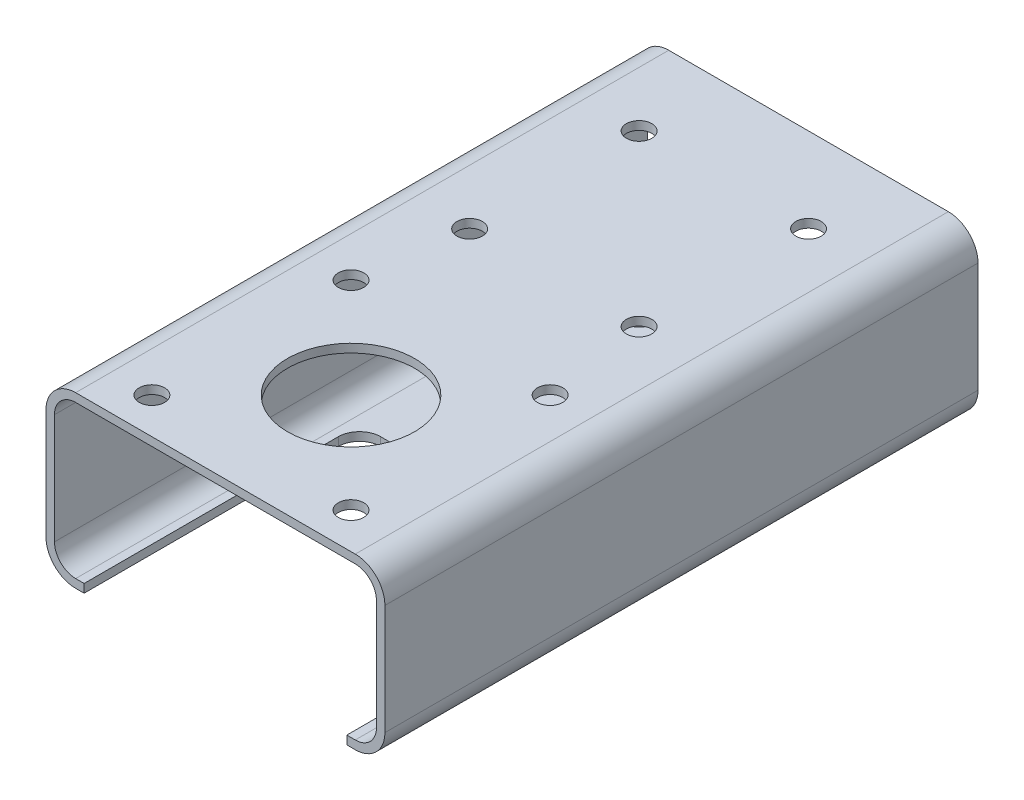
ISO-10303-21;
HEADER;
FILE_DESCRIPTION(('STEP AP214'),'2;1');
FILE_NAME('part.step','',(''),(''),'','','');
FILE_SCHEMA(('AUTOMOTIVE_DESIGN { 1 0 10303 214 1 1 1 1 }'));
ENDSEC;
DATA;
#1=APPLICATION_CONTEXT('core data for automotive mechanical design processes');
#2=APPLICATION_PROTOCOL_DEFINITION('international standard','automotive_design',2000,#1);
#3=PRODUCT_CONTEXT('',#1,'mechanical');
#4=PRODUCT('Part','Part','',(#3));
#5=PRODUCT_RELATED_PRODUCT_CATEGORY('part','',(#4));
#6=PRODUCT_DEFINITION_FORMATION('','',#4);
#7=PRODUCT_DEFINITION_CONTEXT('part definition',#1,'design');
#8=PRODUCT_DEFINITION('design','',#6,#7);
#9=PRODUCT_DEFINITION_SHAPE('','',#8);
#10=(LENGTH_UNIT() NAMED_UNIT(*) SI_UNIT(.MILLI.,.METRE.));
#11=(NAMED_UNIT(*) PLANE_ANGLE_UNIT() SI_UNIT($,.RADIAN.));
#12=(NAMED_UNIT(*) SI_UNIT($,.STERADIAN.) SOLID_ANGLE_UNIT());
#13=UNCERTAINTY_MEASURE_WITH_UNIT(LENGTH_MEASURE(1.E-05),#10,'distance_accuracy_value','');
#14=(GEOMETRIC_REPRESENTATION_CONTEXT(3) GLOBAL_UNCERTAINTY_ASSIGNED_CONTEXT((#13)) GLOBAL_UNIT_ASSIGNED_CONTEXT((#10,
#11,#12)) REPRESENTATION_CONTEXT('',''));
#15=CARTESIAN_POINT('',(0.,0.,0.));
#16=DIRECTION('',(0.,0.,1.));
#17=DIRECTION('',(1.,0.,0.));
#18=AXIS2_PLACEMENT_3D('',#15,#16,#17);
#19=CARTESIAN_POINT('',(71.,5.,140.));
#20=DIRECTION('',(0.,0.,1.));
#21=DIRECTION('',(1.,0.,0.));
#22=AXIS2_PLACEMENT_3D('',#19,#20,#21);
#23=PLANE('',#22);
#24=DIRECTION('',(0.,-1.,0.));
#25=VECTOR('',#24,1.);
#26=CARTESIAN_POINT('',(6.99999999999999,8.,140.));
#27=LINE('',#26,#25);
#28=CARTESIAN_POINT('',(6.99999999999999,0.,140.));
#29=VERTEX_POINT('',#28);
#30=CARTESIAN_POINT('',(6.99999999999999,-2.,140.));
#31=VERTEX_POINT('',#30);
#32=EDGE_CURVE('E199',#29,#31,#27,.T.);
#33=ORIENTED_EDGE('',*,*,#32,.F.);
#34=DIRECTION('',(1.,0.,0.));
#35=VECTOR('',#34,1.);
#36=CARTESIAN_POINT('',(5.,0.,140.));
#37=LINE('',#36,#35);
#38=CARTESIAN_POINT('',(5.,0.,140.));
#39=VERTEX_POINT('',#38);
#40=EDGE_CURVE('E242',#39,#29,#37,.T.);
#41=ORIENTED_EDGE('',*,*,#40,.F.);
#42=CARTESIAN_POINT('',(5.,5.,140.));
#43=DIRECTION('',(0.,0.,1.));
#44=DIRECTION('',(1.,0.,0.));
#45=AXIS2_PLACEMENT_3D('',#42,#43,#44);
#46=CIRCLE('',#45,5.);
#47=CARTESIAN_POINT('',(0.,5.,140.));
#48=VERTEX_POINT('',#47);
#49=EDGE_CURVE('E239',#48,#39,#46,.T.);
#50=ORIENTED_EDGE('',*,*,#49,.F.);
#51=DIRECTION('',(0.,-1.,0.));
#52=VECTOR('',#51,1.);
#53=CARTESIAN_POINT('',(0.,31.,140.));
#54=LINE('',#53,#52);
#55=CARTESIAN_POINT('',(0.,31.,140.));
#56=VERTEX_POINT('',#55);
#57=EDGE_CURVE('E237',#56,#48,#54,.T.);
#58=ORIENTED_EDGE('',*,*,#57,.F.);
#59=CARTESIAN_POINT('',(5.,31.,140.));
#60=DIRECTION('',(0.,0.,1.));
#61=DIRECTION('',(1.,0.,0.));
#62=AXIS2_PLACEMENT_3D('',#59,#60,#61);
#63=CIRCLE('',#62,5.);
#64=CARTESIAN_POINT('',(5.,36.,140.));
#65=VERTEX_POINT('',#64);
#66=EDGE_CURVE('E235',#65,#56,#63,.T.);
#67=ORIENTED_EDGE('',*,*,#66,.F.);
#68=DIRECTION('',(-1.,0.,0.));
#69=VECTOR('',#68,1.);
#70=CARTESIAN_POINT('',(71.,36.,140.));
#71=LINE('',#70,#69);
#72=CARTESIAN_POINT('',(71.,36.,140.));
#73=VERTEX_POINT('',#72);
#74=EDGE_CURVE('E232',#73,#65,#71,.T.);
#75=ORIENTED_EDGE('',*,*,#74,.F.);
#76=CARTESIAN_POINT('',(71.,31.,140.));
#77=DIRECTION('',(0.,0.,1.));
#78=DIRECTION('',(1.,0.,0.));
#79=AXIS2_PLACEMENT_3D('',#76,#77,#78);
#80=CIRCLE('',#79,5.);
#81=CARTESIAN_POINT('',(76.,31.,140.));
#82=VERTEX_POINT('',#81);
#83=EDGE_CURVE('E230',#82,#73,#80,.T.);
#84=ORIENTED_EDGE('',*,*,#83,.F.);
#85=DIRECTION('',(0.,1.,0.));
#86=VECTOR('',#85,1.);
#87=CARTESIAN_POINT('',(76.,5.,140.));
#88=LINE('',#87,#86);
#89=CARTESIAN_POINT('',(76.,5.,140.));
#90=VERTEX_POINT('',#89);
#91=EDGE_CURVE('E247',#90,#82,#88,.T.);
#92=ORIENTED_EDGE('',*,*,#91,.F.);
#93=CARTESIAN_POINT('',(71.,5.,140.));
#94=DIRECTION('',(0.,0.,1.));
#95=DIRECTION('',(1.,0.,0.));
#96=AXIS2_PLACEMENT_3D('',#93,#94,#95);
#97=CIRCLE('',#96,5.);
#98=CARTESIAN_POINT('',(71.,0.,140.));
#99=VERTEX_POINT('',#98);
#100=EDGE_CURVE('E245',#99,#90,#97,.T.);
#101=ORIENTED_EDGE('',*,*,#100,.F.);
#102=CARTESIAN_POINT('',(69.,0.,140.));
#103=VERTEX_POINT('',#102);
#104=EDGE_CURVE('E241',#103,#99,#37,.T.);
#105=ORIENTED_EDGE('',*,*,#104,.F.);
#106=DIRECTION('',(0.,-1.,0.));
#107=VECTOR('',#106,1.);
#108=CARTESIAN_POINT('',(69.,8.,140.));
#109=LINE('',#108,#107);
#110=CARTESIAN_POINT('',(69.,-2.,140.));
#111=VERTEX_POINT('',#110);
#112=EDGE_CURVE('E219',#103,#111,#109,.T.);
#113=ORIENTED_EDGE('',*,*,#112,.T.);
#114=DIRECTION('',(1.,0.,0.));
#115=VECTOR('',#114,1.);
#116=CARTESIAN_POINT('',(5.,-2.,140.));
#117=LINE('',#116,#115);
#118=CARTESIAN_POINT('',(71.,-2.,140.));
#119=VERTEX_POINT('',#118);
#120=EDGE_CURVE('E306',#111,#119,#117,.T.);
#121=ORIENTED_EDGE('',*,*,#120,.T.);
#122=CARTESIAN_POINT('',(71.,5.,140.));
#123=DIRECTION('',(0.,0.,1.));
#124=DIRECTION('',(1.,0.,0.));
#125=AXIS2_PLACEMENT_3D('',#122,#123,#124);
#126=CIRCLE('',#125,7.);
#127=CARTESIAN_POINT('',(78.,5.,140.));
#128=VERTEX_POINT('',#127);
#129=EDGE_CURVE('E290',#119,#128,#126,.T.);
#130=ORIENTED_EDGE('',*,*,#129,.T.);
#131=DIRECTION('',(0.,1.,0.));
#132=VECTOR('',#131,1.);
#133=CARTESIAN_POINT('',(78.,5.,140.));
#134=LINE('',#133,#132);
#135=CARTESIAN_POINT('',(78.,31.,140.));
#136=VERTEX_POINT('',#135);
#137=EDGE_CURVE('E293',#128,#136,#134,.T.);
#138=ORIENTED_EDGE('',*,*,#137,.T.);
#139=CARTESIAN_POINT('',(71.,31.,140.));
#140=DIRECTION('',(0.,0.,1.));
#141=DIRECTION('',(1.,0.,0.));
#142=AXIS2_PLACEMENT_3D('',#139,#140,#141);
#143=CIRCLE('',#142,7.);
#144=CARTESIAN_POINT('',(71.,38.,140.));
#145=VERTEX_POINT('',#144);
#146=EDGE_CURVE('E296',#136,#145,#143,.T.);
#147=ORIENTED_EDGE('',*,*,#146,.T.);
#148=DIRECTION('',(-1.,0.,0.));
#149=VECTOR('',#148,1.);
#150=CARTESIAN_POINT('',(71.,38.,140.));
#151=LINE('',#150,#149);
#152=CARTESIAN_POINT('',(5.,38.,140.));
#153=VERTEX_POINT('',#152);
#154=EDGE_CURVE('E298',#145,#153,#151,.T.);
#155=ORIENTED_EDGE('',*,*,#154,.T.);
#156=CARTESIAN_POINT('',(5.,31.,140.));
#157=DIRECTION('',(0.,0.,1.));
#158=DIRECTION('',(1.,0.,0.));
#159=AXIS2_PLACEMENT_3D('',#156,#157,#158);
#160=CIRCLE('',#159,7.);
#161=CARTESIAN_POINT('',(-2.,31.,140.));
#162=VERTEX_POINT('',#161);
#163=EDGE_CURVE('E300',#153,#162,#160,.T.);
#164=ORIENTED_EDGE('',*,*,#163,.T.);
#165=DIRECTION('',(0.,-1.,0.));
#166=VECTOR('',#165,1.);
#167=CARTESIAN_POINT('',(-1.99999999999999,31.,140.));
#168=LINE('',#167,#166);
#169=CARTESIAN_POINT('',(-2.,5.,140.));
#170=VERTEX_POINT('',#169);
#171=EDGE_CURVE('E302',#162,#170,#168,.T.);
#172=ORIENTED_EDGE('',*,*,#171,.T.);
#173=CARTESIAN_POINT('',(5.,5.,140.));
#174=DIRECTION('',(0.,0.,1.));
#175=DIRECTION('',(1.,0.,0.));
#176=AXIS2_PLACEMENT_3D('',#173,#174,#175);
#177=CIRCLE('',#176,7.);
#178=CARTESIAN_POINT('',(5.,-2.,140.));
#179=VERTEX_POINT('',#178);
#180=EDGE_CURVE('E304',#170,#179,#177,.T.);
#181=ORIENTED_EDGE('',*,*,#180,.T.);
#182=EDGE_CURVE('E307',#179,#31,#117,.T.);
#183=ORIENTED_EDGE('',*,*,#182,.T.);
#184=EDGE_LOOP('',(#33,#41,#50,#58,#67,#75,#84,#92,#101,#105,#113,#121,#130,#138,#147,#155,#164,
#172,#181,#183));
#185=FACE_BOUND('',#184,.T.);
#186=ADVANCED_FACE('F35',(#185),#23,.T.);
#187=CARTESIAN_POINT('',(71.,5.,0.));
#188=DIRECTION('',(0.,0.,1.));
#189=DIRECTION('',(1.,0.,0.));
#190=AXIS2_PLACEMENT_3D('',#187,#188,#189);
#191=PLANE('',#190);
#192=CARTESIAN_POINT('',(71.,5.,0.));
#193=DIRECTION('',(0.,0.,1.));
#194=DIRECTION('',(1.,0.,0.));
#195=AXIS2_PLACEMENT_3D('',#192,#193,#194);
#196=CIRCLE('',#195,7.);
#197=CARTESIAN_POINT('',(71.,-2.,0.));
#198=VERTEX_POINT('',#197);
#199=CARTESIAN_POINT('',(78.,5.,0.));
#200=VERTEX_POINT('',#199);
#201=EDGE_CURVE('E289',#198,#200,#196,.T.);
#202=ORIENTED_EDGE('',*,*,#201,.F.);
#203=DIRECTION('',(1.,0.,0.));
#204=VECTOR('',#203,1.);
#205=CARTESIAN_POINT('',(5.,-2.,0.));
#206=LINE('',#205,#204);
#207=CARTESIAN_POINT('',(5.,-2.,0.));
#208=VERTEX_POINT('',#207);
#209=EDGE_CURVE('E294',#208,#198,#206,.T.);
#210=ORIENTED_EDGE('',*,*,#209,.F.);
#211=CARTESIAN_POINT('',(5.,5.,0.));
#212=DIRECTION('',(0.,0.,1.));
#213=DIRECTION('',(1.,0.,0.));
#214=AXIS2_PLACEMENT_3D('',#211,#212,#213);
#215=CIRCLE('',#214,7.);
#216=CARTESIAN_POINT('',(-2.,5.,0.));
#217=VERTEX_POINT('',#216);
#218=EDGE_CURVE('E322',#217,#208,#215,.T.);
#219=ORIENTED_EDGE('',*,*,#218,.F.);
#220=DIRECTION('',(0.,-1.,0.));
#221=VECTOR('',#220,1.);
#222=CARTESIAN_POINT('',(-1.99999999999999,31.,0.));
#223=LINE('',#222,#221);
#224=CARTESIAN_POINT('',(-2.,31.,0.));
#225=VERTEX_POINT('',#224);
#226=EDGE_CURVE('E320',#225,#217,#223,.T.);
#227=ORIENTED_EDGE('',*,*,#226,.F.);
#228=CARTESIAN_POINT('',(5.,31.,0.));
#229=DIRECTION('',(0.,0.,1.));
#230=DIRECTION('',(1.,0.,0.));
#231=AXIS2_PLACEMENT_3D('',#228,#229,#230);
#232=CIRCLE('',#231,7.);
#233=CARTESIAN_POINT('',(5.,38.,0.));
#234=VERTEX_POINT('',#233);
#235=EDGE_CURVE('E318',#234,#225,#232,.T.);
#236=ORIENTED_EDGE('',*,*,#235,.F.);
#237=DIRECTION('',(-1.,0.,0.));
#238=VECTOR('',#237,1.);
#239=CARTESIAN_POINT('',(71.,38.,0.));
#240=LINE('',#239,#238);
#241=CARTESIAN_POINT('',(71.,38.,0.));
#242=VERTEX_POINT('',#241);
#243=EDGE_CURVE('E316',#242,#234,#240,.T.);
#244=ORIENTED_EDGE('',*,*,#243,.F.);
#245=CARTESIAN_POINT('',(71.,31.,0.));
#246=DIRECTION('',(0.,0.,1.));
#247=DIRECTION('',(1.,0.,0.));
#248=AXIS2_PLACEMENT_3D('',#245,#246,#247);
#249=CIRCLE('',#248,7.);
#250=CARTESIAN_POINT('',(78.,31.,0.));
#251=VERTEX_POINT('',#250);
#252=EDGE_CURVE('E314',#251,#242,#249,.T.);
#253=ORIENTED_EDGE('',*,*,#252,.F.);
#254=DIRECTION('',(0.,1.,0.));
#255=VECTOR('',#254,1.);
#256=CARTESIAN_POINT('',(78.,5.,0.));
#257=LINE('',#256,#255);
#258=EDGE_CURVE('E312',#200,#251,#257,.T.);
#259=ORIENTED_EDGE('',*,*,#258,.F.);
#260=EDGE_LOOP('',(#202,#210,#219,#227,#236,#244,#253,#259));
#261=FACE_BOUND('',#260,.T.);
#262=CARTESIAN_POINT('',(71.,31.,0.));
#263=DIRECTION('',(0.,0.,1.));
#264=DIRECTION('',(1.,0.,0.));
#265=AXIS2_PLACEMENT_3D('',#262,#263,#264);
#266=CIRCLE('',#265,5.);
#267=CARTESIAN_POINT('',(76.,31.,0.));
#268=VERTEX_POINT('',#267);
#269=CARTESIAN_POINT('',(71.,36.,0.));
#270=VERTEX_POINT('',#269);
#271=EDGE_CURVE('E250',#268,#270,#266,.T.);
#272=ORIENTED_EDGE('',*,*,#271,.T.);
#273=DIRECTION('',(-1.,0.,0.));
#274=VECTOR('',#273,1.);
#275=CARTESIAN_POINT('',(71.,36.,0.));
#276=LINE('',#275,#274);
#277=CARTESIAN_POINT('',(5.,36.,0.));
#278=VERTEX_POINT('',#277);
#279=EDGE_CURVE('E253',#270,#278,#276,.T.);
#280=ORIENTED_EDGE('',*,*,#279,.T.);
#281=CARTESIAN_POINT('',(5.,31.,0.));
#282=DIRECTION('',(0.,0.,1.));
#283=DIRECTION('',(1.,0.,0.));
#284=AXIS2_PLACEMENT_3D('',#281,#282,#283);
#285=CIRCLE('',#284,5.);
#286=CARTESIAN_POINT('',(0.,31.,0.));
#287=VERTEX_POINT('',#286);
#288=EDGE_CURVE('E256',#278,#287,#285,.T.);
#289=ORIENTED_EDGE('',*,*,#288,.T.);
#290=DIRECTION('',(0.,-1.,0.));
#291=VECTOR('',#290,1.);
#292=CARTESIAN_POINT('',(0.,31.,0.));
#293=LINE('',#292,#291);
#294=CARTESIAN_POINT('',(0.,5.,0.));
#295=VERTEX_POINT('',#294);
#296=EDGE_CURVE('E259',#287,#295,#293,.T.);
#297=ORIENTED_EDGE('',*,*,#296,.T.);
#298=CARTESIAN_POINT('',(5.,5.,0.));
#299=DIRECTION('',(0.,0.,1.));
#300=DIRECTION('',(1.,0.,0.));
#301=AXIS2_PLACEMENT_3D('',#298,#299,#300);
#302=CIRCLE('',#301,5.);
#303=CARTESIAN_POINT('',(5.,0.,0.));
#304=VERTEX_POINT('',#303);
#305=EDGE_CURVE('E262',#295,#304,#302,.T.);
#306=ORIENTED_EDGE('',*,*,#305,.T.);
#307=DIRECTION('',(1.,0.,0.));
#308=VECTOR('',#307,1.);
#309=CARTESIAN_POINT('',(5.,0.,0.));
#310=LINE('',#309,#308);
#311=CARTESIAN_POINT('',(71.,0.,0.));
#312=VERTEX_POINT('',#311);
#313=EDGE_CURVE('E265',#304,#312,#310,.T.);
#314=ORIENTED_EDGE('',*,*,#313,.T.);
#315=CARTESIAN_POINT('',(71.,5.,0.));
#316=DIRECTION('',(0.,0.,1.));
#317=DIRECTION('',(1.,0.,0.));
#318=AXIS2_PLACEMENT_3D('',#315,#316,#317);
#319=CIRCLE('',#318,5.);
#320=CARTESIAN_POINT('',(76.,5.,0.));
#321=VERTEX_POINT('',#320);
#322=EDGE_CURVE('E268',#312,#321,#319,.T.);
#323=ORIENTED_EDGE('',*,*,#322,.T.);
#324=DIRECTION('',(0.,1.,0.));
#325=VECTOR('',#324,1.);
#326=CARTESIAN_POINT('',(76.,5.,0.));
#327=LINE('',#326,#325);
#328=EDGE_CURVE('E233',#321,#268,#327,.T.);
#329=ORIENTED_EDGE('',*,*,#328,.T.);
#330=EDGE_LOOP('',(#272,#280,#289,#297,#306,#314,#323,#329));
#331=FACE_BOUND('',#330,.T.);
#332=ADVANCED_FACE('F436',(#261,#331),#191,.F.);
#333=CARTESIAN_POINT('',(71.,5.,140.));
#334=DIRECTION('',(0.,0.,-1.));
#335=DIRECTION('',(-1.,0.,0.));
#336=AXIS2_PLACEMENT_3D('',#333,#334,#335);
#337=CYLINDRICAL_SURFACE('',#336,7.);
#338=ORIENTED_EDGE('',*,*,#201,.T.);
#339=DIRECTION('',(0.,0.,-1.));
#340=VECTOR('',#339,1.);
#341=CARTESIAN_POINT('',(78.,5.,140.));
#342=LINE('',#341,#340);
#343=EDGE_CURVE('E345',#128,#200,#342,.T.);
#344=ORIENTED_EDGE('',*,*,#343,.F.);
#345=ORIENTED_EDGE('',*,*,#129,.F.);
#346=DIRECTION('',(0.,0.,-1.));
#347=VECTOR('',#346,1.);
#348=CARTESIAN_POINT('',(71.,-2.,140.));
#349=LINE('',#348,#347);
#350=EDGE_CURVE('E309',#119,#198,#349,.T.);
#351=ORIENTED_EDGE('',*,*,#350,.T.);
#352=EDGE_LOOP('',(#338,#344,#345,#351));
#353=FACE_BOUND('',#352,.T.);
#354=ADVANCED_FACE('F37',(#353),#337,.T.);
#355=CARTESIAN_POINT('',(78.,5.,140.));
#356=DIRECTION('',(-1.,0.,0.));
#357=DIRECTION('',(0.,0.,1.));
#358=AXIS2_PLACEMENT_3D('',#355,#356,#357);
#359=PLANE('',#358);
#360=ORIENTED_EDGE('',*,*,#258,.T.);
#361=DIRECTION('',(0.,0.,-1.));
#362=VECTOR('',#361,1.);
#363=CARTESIAN_POINT('',(78.,31.,140.));
#364=LINE('',#363,#362);
#365=EDGE_CURVE('E342',#136,#251,#364,.T.);
#366=ORIENTED_EDGE('',*,*,#365,.F.);
#367=ORIENTED_EDGE('',*,*,#137,.F.);
#368=ORIENTED_EDGE('',*,*,#343,.T.);
#369=EDGE_LOOP('',(#360,#366,#367,#368));
#370=FACE_BOUND('',#369,.T.);
#371=ADVANCED_FACE('F454',(#370),#359,.F.);
#372=CARTESIAN_POINT('',(71.,31.,140.));
#373=DIRECTION('',(0.,0.,-1.));
#374=DIRECTION('',(-1.,0.,0.));
#375=AXIS2_PLACEMENT_3D('',#372,#373,#374);
#376=CYLINDRICAL_SURFACE('',#375,7.);
#377=ORIENTED_EDGE('',*,*,#252,.T.);
#378=DIRECTION('',(0.,0.,-1.));
#379=VECTOR('',#378,1.);
#380=CARTESIAN_POINT('',(71.,38.,140.));
#381=LINE('',#380,#379);
#382=EDGE_CURVE('E339',#145,#242,#381,.T.);
#383=ORIENTED_EDGE('',*,*,#382,.F.);
#384=ORIENTED_EDGE('',*,*,#146,.F.);
#385=ORIENTED_EDGE('',*,*,#365,.T.);
#386=EDGE_LOOP('',(#377,#383,#384,#385));
#387=FACE_BOUND('',#386,.T.);
#388=ADVANCED_FACE('F419',(#387),#376,.T.);
#389=CARTESIAN_POINT('',(71.,38.,140.));
#390=DIRECTION('',(0.,-1.,0.));
#391=DIRECTION('',(1.,0.,0.));
#392=AXIS2_PLACEMENT_3D('',#389,#390,#391);
#393=PLANE('',#392);
#394=CARTESIAN_POINT('',(18.,38.,20.));
#395=DIRECTION('',(0.,1.,0.));
#396=DIRECTION('',(0.,0.,-1.));
#397=AXIS2_PLACEMENT_3D('',#394,#395,#396);
#398=CIRCLE('',#397,3.);
#399=CARTESIAN_POINT('',(18.,38.,17.));
#400=VERTEX_POINT('',#399);
#401=EDGE_CURVE('E805',#400,#400,#398,.T.);
#402=ORIENTED_EDGE('',*,*,#401,.F.);
#403=EDGE_LOOP('',(#402));
#404=FACE_BOUND('',#403,.T.);
#405=CARTESIAN_POINT('',(58.,38.,60.));
#406=DIRECTION('',(0.,1.,0.));
#407=DIRECTION('',(0.,0.,-1.));
#408=AXIS2_PLACEMENT_3D('',#405,#406,#407);
#409=CIRCLE('',#408,3.);
#410=CARTESIAN_POINT('',(58.,38.,57.));
#411=VERTEX_POINT('',#410);
#412=EDGE_CURVE('E806',#411,#411,#409,.T.);
#413=ORIENTED_EDGE('',*,*,#412,.F.);
#414=EDGE_LOOP('',(#413));
#415=FACE_BOUND('',#414,.T.);
#416=CARTESIAN_POINT('',(18.,38.,60.));
#417=DIRECTION('',(0.,1.,0.));
#418=DIRECTION('',(0.,0.,1.));
#419=AXIS2_PLACEMENT_3D('',#416,#417,#418);
#420=CIRCLE('',#419,3.);
#421=CARTESIAN_POINT('',(18.,38.,63.));
#422=VERTEX_POINT('',#421);
#423=EDGE_CURVE('E811',#422,#422,#420,.T.);
#424=ORIENTED_EDGE('',*,*,#423,.F.);
#425=EDGE_LOOP('',(#424));
#426=FACE_BOUND('',#425,.T.);
#427=CARTESIAN_POINT('',(58.,38.,20.));
#428=DIRECTION('',(0.,1.,0.));
#429=DIRECTION('',(0.,0.,1.));
#430=AXIS2_PLACEMENT_3D('',#427,#428,#429);
#431=CIRCLE('',#430,3.);
#432=CARTESIAN_POINT('',(58.,38.,23.));
#433=VERTEX_POINT('',#432);
#434=EDGE_CURVE('E372',#433,#433,#431,.T.);
#435=ORIENTED_EDGE('',*,*,#434,.F.);
#436=EDGE_LOOP('',(#435));
#437=FACE_BOUND('',#436,.T.);
#438=CARTESIAN_POINT('',(61.5,38.,131.5));
#439=DIRECTION('',(0.,1.,0.));
#440=DIRECTION('',(0.,0.,-1.));
#441=AXIS2_PLACEMENT_3D('',#438,#439,#440);
#442=CIRCLE('',#441,3.00000000000001);
#443=CARTESIAN_POINT('',(61.5,38.,128.5));
#444=VERTEX_POINT('',#443);
#445=EDGE_CURVE('E402',#444,#444,#442,.T.);
#446=ORIENTED_EDGE('',*,*,#445,.F.);
#447=EDGE_LOOP('',(#446));
#448=FACE_BOUND('',#447,.T.);
#449=CARTESIAN_POINT('',(14.5,38.,131.5));
#450=DIRECTION('',(0.,1.,0.));
#451=DIRECTION('',(0.,0.,1.));
#452=AXIS2_PLACEMENT_3D('',#449,#450,#451);
#453=CIRCLE('',#452,3.);
#454=CARTESIAN_POINT('',(14.5,38.,134.5));
#455=VERTEX_POINT('',#454);
#456=EDGE_CURVE('E406',#455,#455,#453,.T.);
#457=ORIENTED_EDGE('',*,*,#456,.F.);
#458=EDGE_LOOP('',(#457));
#459=FACE_BOUND('',#458,.T.);
#460=CARTESIAN_POINT('',(14.5,38.,84.5));
#461=DIRECTION('',(0.,1.,0.));
#462=DIRECTION('',(0.,0.,-1.));
#463=AXIS2_PLACEMENT_3D('',#460,#461,#462);
#464=CIRCLE('',#463,3.);
#465=CARTESIAN_POINT('',(14.5,38.,81.5));
#466=VERTEX_POINT('',#465);
#467=EDGE_CURVE('E403',#466,#466,#464,.T.);
#468=ORIENTED_EDGE('',*,*,#467,.F.);
#469=EDGE_LOOP('',(#468));
#470=FACE_BOUND('',#469,.T.);
#471=CARTESIAN_POINT('',(61.5,38.,84.5));
#472=DIRECTION('',(0.,1.,0.));
#473=DIRECTION('',(0.,0.,1.));
#474=AXIS2_PLACEMENT_3D('',#471,#472,#473);
#475=CIRCLE('',#474,3.00000000000001);
#476=CARTESIAN_POINT('',(61.5,38.,87.5));
#477=VERTEX_POINT('',#476);
#478=EDGE_CURVE('E360',#477,#477,#475,.T.);
#479=ORIENTED_EDGE('',*,*,#478,.F.);
#480=EDGE_LOOP('',(#479));
#481=FACE_BOUND('',#480,.T.);
#482=CARTESIAN_POINT('',(38.,38.,108.));
#483=DIRECTION('',(0.,1.,0.));
#484=DIRECTION('',(0.,0.,1.));
#485=AXIS2_PLACEMENT_3D('',#482,#483,#484);
#486=CIRCLE('',#485,15.);
#487=CARTESIAN_POINT('',(38.,38.,123.));
#488=VERTEX_POINT('',#487);
#489=EDGE_CURVE('E218',#488,#488,#486,.T.);
#490=ORIENTED_EDGE('',*,*,#489,.F.);
#491=EDGE_LOOP('',(#490));
#492=FACE_BOUND('',#491,.T.);
#493=ORIENTED_EDGE('',*,*,#243,.T.);
#494=DIRECTION('',(0.,0.,-1.));
#495=VECTOR('',#494,1.);
#496=CARTESIAN_POINT('',(5.,38.,140.));
#497=LINE('',#496,#495);
#498=EDGE_CURVE('E336',#153,#234,#497,.T.);
#499=ORIENTED_EDGE('',*,*,#498,.F.);
#500=ORIENTED_EDGE('',*,*,#154,.F.);
#501=ORIENTED_EDGE('',*,*,#382,.T.);
#502=EDGE_LOOP('',(#493,#499,#500,#501));
#503=FACE_BOUND('',#502,.T.);
#504=ADVANCED_FACE('F415',(#404,#415,#426,#437,#448,#459,#470,#481,#492,#503),#393,.F.);
#505=CARTESIAN_POINT('',(5.,31.,140.));
#506=DIRECTION('',(0.,0.,-1.));
#507=DIRECTION('',(-1.,0.,0.));
#508=AXIS2_PLACEMENT_3D('',#505,#506,#507);
#509=CYLINDRICAL_SURFACE('',#508,7.);
#510=ORIENTED_EDGE('',*,*,#235,.T.);
#511=DIRECTION('',(0.,0.,-1.));
#512=VECTOR('',#511,1.);
#513=CARTESIAN_POINT('',(-2.,31.,140.));
#514=LINE('',#513,#512);
#515=EDGE_CURVE('E333',#162,#225,#514,.T.);
#516=ORIENTED_EDGE('',*,*,#515,.F.);
#517=ORIENTED_EDGE('',*,*,#163,.F.);
#518=ORIENTED_EDGE('',*,*,#498,.T.);
#519=EDGE_LOOP('',(#510,#516,#517,#518));
#520=FACE_BOUND('',#519,.T.);
#521=ADVANCED_FACE('F418',(#520),#509,.T.);
#522=CARTESIAN_POINT('',(-1.99999999999999,31.,140.));
#523=DIRECTION('',(1.,0.,0.));
#524=DIRECTION('',(0.,1.,0.));
#525=AXIS2_PLACEMENT_3D('',#522,#523,#524);
#526=PLANE('',#525);
#527=ORIENTED_EDGE('',*,*,#226,.T.);
#528=DIRECTION('',(0.,0.,-1.));
#529=VECTOR('',#528,1.);
#530=CARTESIAN_POINT('',(-2.,5.,140.));
#531=LINE('',#530,#529);
#532=EDGE_CURVE('E330',#170,#217,#531,.T.);
#533=ORIENTED_EDGE('',*,*,#532,.F.);
#534=ORIENTED_EDGE('',*,*,#171,.F.);
#535=ORIENTED_EDGE('',*,*,#515,.T.);
#536=EDGE_LOOP('',(#527,#533,#534,#535));
#537=FACE_BOUND('',#536,.T.);
#538=ADVANCED_FACE('F442',(#537),#526,.F.);
#539=CARTESIAN_POINT('',(5.,5.,140.));
#540=DIRECTION('',(0.,0.,-1.));
#541=DIRECTION('',(-1.,0.,0.));
#542=AXIS2_PLACEMENT_3D('',#539,#540,#541);
#543=CYLINDRICAL_SURFACE('',#542,7.);
#544=ORIENTED_EDGE('',*,*,#218,.T.);
#545=DIRECTION('',(0.,0.,-1.));
#546=VECTOR('',#545,1.);
#547=CARTESIAN_POINT('',(5.,-2.,140.));
#548=LINE('',#547,#546);
#549=EDGE_CURVE('E327',#179,#208,#548,.T.);
#550=ORIENTED_EDGE('',*,*,#549,.F.);
#551=ORIENTED_EDGE('',*,*,#180,.F.);
#552=ORIENTED_EDGE('',*,*,#532,.T.);
#553=EDGE_LOOP('',(#544,#550,#551,#552));
#554=FACE_BOUND('',#553,.T.);
#555=ADVANCED_FACE('F446',(#554),#543,.T.);
#556=CARTESIAN_POINT('',(5.,-2.,140.));
#557=DIRECTION('',(0.,1.,0.));
#558=DIRECTION('',(-1.,0.,0.));
#559=AXIS2_PLACEMENT_3D('',#556,#557,#558);
#560=PLANE('',#559);
#561=CARTESIAN_POINT('',(18.,-2.,20.));
#562=DIRECTION('',(0.,1.,0.));
#563=DIRECTION('',(-1.,0.,0.));
#564=AXIS2_PLACEMENT_3D('',#561,#562,#563);
#565=CIRCLE('',#564,3.);
#566=CARTESIAN_POINT('',(15.,-2.,20.));
#567=VERTEX_POINT('',#566);
#568=EDGE_CURVE('E399',#567,#567,#565,.T.);
#569=ORIENTED_EDGE('',*,*,#568,.T.);
#570=EDGE_LOOP('',(#569));
#571=FACE_BOUND('',#570,.T.);
#572=CARTESIAN_POINT('',(58.,-2.,60.));
#573=DIRECTION('',(0.,1.,0.));
#574=DIRECTION('',(-1.,0.,0.));
#575=AXIS2_PLACEMENT_3D('',#572,#573,#574);
#576=CIRCLE('',#575,3.);
#577=CARTESIAN_POINT('',(55.,-2.,60.));
#578=VERTEX_POINT('',#577);
#579=EDGE_CURVE('E384',#578,#578,#576,.T.);
#580=ORIENTED_EDGE('',*,*,#579,.T.);
#581=EDGE_LOOP('',(#580));
#582=FACE_BOUND('',#581,.T.);
#583=CARTESIAN_POINT('',(18.,-2.,60.));
#584=DIRECTION('',(0.,1.,0.));
#585=DIRECTION('',(-1.,0.,0.));
#586=AXIS2_PLACEMENT_3D('',#583,#584,#585);
#587=CIRCLE('',#586,3.);
#588=CARTESIAN_POINT('',(15.,-2.,60.));
#589=VERTEX_POINT('',#588);
#590=EDGE_CURVE('E380',#589,#589,#587,.T.);
#591=ORIENTED_EDGE('',*,*,#590,.T.);
#592=EDGE_LOOP('',(#591));
#593=FACE_BOUND('',#592,.T.);
#594=CARTESIAN_POINT('',(58.,-2.,20.));
#595=DIRECTION('',(0.,1.,0.));
#596=DIRECTION('',(-1.,0.,0.));
#597=AXIS2_PLACEMENT_3D('',#594,#595,#596);
#598=CIRCLE('',#597,3.);
#599=CARTESIAN_POINT('',(55.,-2.,20.));
#600=VERTEX_POINT('',#599);
#601=EDGE_CURVE('E376',#600,#600,#598,.T.);
#602=ORIENTED_EDGE('',*,*,#601,.T.);
#603=EDGE_LOOP('',(#602));
#604=FACE_BOUND('',#603,.T.);
#605=CARTESIAN_POINT('',(12.,-2.,80.));
#606=DIRECTION('',(0.,-1.,0.));
#607=DIRECTION('',(1.,0.,0.));
#608=AXIS2_PLACEMENT_3D('',#605,#606,#607);
#609=CIRCLE('',#608,5.);
#610=CARTESIAN_POINT('',(6.99999999999998,-2.,80.));
#611=VERTEX_POINT('',#610);
#612=CARTESIAN_POINT('',(12.,-2.,75.));
#613=VERTEX_POINT('',#612);
#614=EDGE_CURVE('E187',#611,#613,#609,.T.);
#615=ORIENTED_EDGE('',*,*,#614,.F.);
#616=DIRECTION('',(0.,0.,-1.));
#617=VECTOR('',#616,1.);
#618=CARTESIAN_POINT('',(6.99999999999999,-2.,140.));
#619=LINE('',#618,#617);
#620=EDGE_CURVE('E196',#31,#611,#619,.T.);
#621=ORIENTED_EDGE('',*,*,#620,.F.);
#622=ORIENTED_EDGE('',*,*,#182,.F.);
#623=ORIENTED_EDGE('',*,*,#549,.T.);
#624=ORIENTED_EDGE('',*,*,#209,.T.);
#625=ORIENTED_EDGE('',*,*,#350,.F.);
#626=ORIENTED_EDGE('',*,*,#120,.F.);
#627=DIRECTION('',(0.,0.,1.));
#628=VECTOR('',#627,1.);
#629=CARTESIAN_POINT('',(69.,-2.,140.));
#630=LINE('',#629,#628);
#631=CARTESIAN_POINT('',(69.,-2.,80.));
#632=VERTEX_POINT('',#631);
#633=EDGE_CURVE('E193',#632,#111,#630,.T.);
#634=ORIENTED_EDGE('',*,*,#633,.F.);
#635=CARTESIAN_POINT('',(64.,-2.,80.));
#636=DIRECTION('',(0.,-1.,0.));
#637=DIRECTION('',(1.,0.,0.));
#638=AXIS2_PLACEMENT_3D('',#635,#636,#637);
#639=CIRCLE('',#638,5.);
#640=CARTESIAN_POINT('',(64.,-2.,75.));
#641=VERTEX_POINT('',#640);
#642=EDGE_CURVE('E210',#641,#632,#639,.T.);
#643=ORIENTED_EDGE('',*,*,#642,.F.);
#644=DIRECTION('',(1.,0.,0.));
#645=VECTOR('',#644,1.);
#646=CARTESIAN_POINT('',(12.,-2.,75.));
#647=LINE('',#646,#645);
#648=EDGE_CURVE('E208',#613,#641,#647,.T.);
#649=ORIENTED_EDGE('',*,*,#648,.F.);
#650=EDGE_LOOP('',(#615,#621,#622,#623,#624,#625,#626,#634,#643,#649));
#651=FACE_BOUND('',#650,.T.);
#652=ADVANCED_FACE('F205',(#571,#582,#593,#604,#651),#560,.F.);
#653=CARTESIAN_POINT('',(71.,31.,140.));
#654=DIRECTION('',(0.,0.,-1.));
#655=DIRECTION('',(-1.,0.,0.));
#656=AXIS2_PLACEMENT_3D('',#653,#654,#655);
#657=CYLINDRICAL_SURFACE('',#656,5.);
#658=ORIENTED_EDGE('',*,*,#271,.F.);
#659=DIRECTION('',(0.,0.,-1.));
#660=VECTOR('',#659,1.);
#661=CARTESIAN_POINT('',(76.,31.,140.));
#662=LINE('',#661,#660);
#663=EDGE_CURVE('E249',#82,#268,#662,.T.);
#664=ORIENTED_EDGE('',*,*,#663,.F.);
#665=ORIENTED_EDGE('',*,*,#83,.T.);
#666=DIRECTION('',(0.,0.,-1.));
#667=VECTOR('',#666,1.);
#668=CARTESIAN_POINT('',(71.,36.,140.));
#669=LINE('',#668,#667);
#670=EDGE_CURVE('E286',#73,#270,#669,.T.);
#671=ORIENTED_EDGE('',*,*,#670,.T.);
#672=EDGE_LOOP('',(#658,#664,#665,#671));
#673=FACE_BOUND('',#672,.T.);
#674=ADVANCED_FACE('F502',(#673),#657,.F.);
#675=CARTESIAN_POINT('',(71.,36.,140.));
#676=DIRECTION('',(0.,-1.,0.));
#677=DIRECTION('',(1.,0.,0.));
#678=AXIS2_PLACEMENT_3D('',#675,#676,#677);
#679=PLANE('',#678);
#680=CARTESIAN_POINT('',(18.,36.,20.));
#681=DIRECTION('',(0.,-1.,0.));
#682=DIRECTION('',(1.,0.,0.));
#683=AXIS2_PLACEMENT_3D('',#680,#681,#682);
#684=CIRCLE('',#683,3.);
#685=CARTESIAN_POINT('',(21.,36.,20.));
#686=VERTEX_POINT('',#685);
#687=EDGE_CURVE('E396',#686,#686,#684,.T.);
#688=ORIENTED_EDGE('',*,*,#687,.F.);
#689=EDGE_LOOP('',(#688));
#690=FACE_BOUND('',#689,.T.);
#691=CARTESIAN_POINT('',(58.,36.,60.));
#692=DIRECTION('',(0.,-1.,0.));
#693=DIRECTION('',(1.,0.,0.));
#694=AXIS2_PLACEMENT_3D('',#691,#692,#693);
#695=CIRCLE('',#694,3.);
#696=CARTESIAN_POINT('',(61.,36.,60.));
#697=VERTEX_POINT('',#696);
#698=EDGE_CURVE('E379',#697,#697,#695,.T.);
#699=ORIENTED_EDGE('',*,*,#698,.F.);
#700=EDGE_LOOP('',(#699));
#701=FACE_BOUND('',#700,.T.);
#702=CARTESIAN_POINT('',(18.,36.,60.));
#703=DIRECTION('',(0.,-1.,0.));
#704=DIRECTION('',(1.,0.,0.));
#705=AXIS2_PLACEMENT_3D('',#702,#703,#704);
#706=CIRCLE('',#705,3.);
#707=CARTESIAN_POINT('',(21.,36.,60.));
#708=VERTEX_POINT('',#707);
#709=EDGE_CURVE('E375',#708,#708,#706,.T.);
#710=ORIENTED_EDGE('',*,*,#709,.F.);
#711=EDGE_LOOP('',(#710));
#712=FACE_BOUND('',#711,.T.);
#713=CARTESIAN_POINT('',(58.,36.,20.));
#714=DIRECTION('',(0.,-1.,0.));
#715=DIRECTION('',(1.,0.,0.));
#716=AXIS2_PLACEMENT_3D('',#713,#714,#715);
#717=CIRCLE('',#716,3.);
#718=CARTESIAN_POINT('',(61.,36.,20.));
#719=VERTEX_POINT('',#718);
#720=EDGE_CURVE('E371',#719,#719,#717,.T.);
#721=ORIENTED_EDGE('',*,*,#720,.F.);
#722=EDGE_LOOP('',(#721));
#723=FACE_BOUND('',#722,.T.);
#724=CARTESIAN_POINT('',(61.5,36.,131.5));
#725=DIRECTION('',(0.,-1.,0.));
#726=DIRECTION('',(1.,0.,0.));
#727=AXIS2_PLACEMENT_3D('',#724,#725,#726);
#728=CIRCLE('',#727,3.00000000000001);
#729=CARTESIAN_POINT('',(64.5,36.,131.5));
#730=VERTEX_POINT('',#729);
#731=EDGE_CURVE('E203',#730,#730,#728,.T.);
#732=ORIENTED_EDGE('',*,*,#731,.F.);
#733=EDGE_LOOP('',(#732));
#734=FACE_BOUND('',#733,.T.);
#735=CARTESIAN_POINT('',(14.5,36.,131.5));
#736=DIRECTION('',(0.,-1.,0.));
#737=DIRECTION('',(1.,0.,0.));
#738=AXIS2_PLACEMENT_3D('',#735,#736,#737);
#739=CIRCLE('',#738,3.);
#740=CARTESIAN_POINT('',(17.5,36.,131.5));
#741=VERTEX_POINT('',#740);
#742=EDGE_CURVE('E363',#741,#741,#739,.T.);
#743=ORIENTED_EDGE('',*,*,#742,.F.);
#744=EDGE_LOOP('',(#743));
#745=FACE_BOUND('',#744,.T.);
#746=CARTESIAN_POINT('',(14.5,36.,84.5));
#747=DIRECTION('',(0.,-1.,0.));
#748=DIRECTION('',(1.,0.,0.));
#749=AXIS2_PLACEMENT_3D('',#746,#747,#748);
#750=CIRCLE('',#749,3.);
#751=CARTESIAN_POINT('',(17.5,36.,84.5));
#752=VERTEX_POINT('',#751);
#753=EDGE_CURVE('E359',#752,#752,#750,.T.);
#754=ORIENTED_EDGE('',*,*,#753,.F.);
#755=EDGE_LOOP('',(#754));
#756=FACE_BOUND('',#755,.T.);
#757=CARTESIAN_POINT('',(61.5,36.,84.5));
#758=DIRECTION('',(0.,-1.,0.));
#759=DIRECTION('',(1.,0.,0.));
#760=AXIS2_PLACEMENT_3D('',#757,#758,#759);
#761=CIRCLE('',#760,3.00000000000001);
#762=CARTESIAN_POINT('',(64.5,36.,84.5));
#763=VERTEX_POINT('',#762);
#764=EDGE_CURVE('E356',#763,#763,#761,.T.);
#765=ORIENTED_EDGE('',*,*,#764,.F.);
#766=EDGE_LOOP('',(#765));
#767=FACE_BOUND('',#766,.T.);
#768=CARTESIAN_POINT('',(38.,36.,108.));
#769=DIRECTION('',(0.,-1.,0.));
#770=DIRECTION('',(1.,0.,0.));
#771=AXIS2_PLACEMENT_3D('',#768,#769,#770);
#772=CIRCLE('',#771,15.);
#773=CARTESIAN_POINT('',(53.,36.,108.));
#774=VERTEX_POINT('',#773);
#775=EDGE_CURVE('E229',#774,#774,#772,.T.);
#776=ORIENTED_EDGE('',*,*,#775,.F.);
#777=EDGE_LOOP('',(#776));
#778=FACE_BOUND('',#777,.T.);
#779=ORIENTED_EDGE('',*,*,#279,.F.);
#780=ORIENTED_EDGE('',*,*,#670,.F.);
#781=ORIENTED_EDGE('',*,*,#74,.T.);
#782=DIRECTION('',(0.,0.,-1.));
#783=VECTOR('',#782,1.);
#784=CARTESIAN_POINT('',(5.,36.,140.));
#785=LINE('',#784,#783);
#786=EDGE_CURVE('E284',#65,#278,#785,.T.);
#787=ORIENTED_EDGE('',*,*,#786,.T.);
#788=EDGE_LOOP('',(#779,#780,#781,#787));
#789=FACE_BOUND('',#788,.T.);
#790=ADVANCED_FACE('F500',(#690,#701,#712,#723,#734,#745,#756,#767,#778,#789),#679,.T.);
#791=CARTESIAN_POINT('',(5.,31.,140.));
#792=DIRECTION('',(0.,0.,-1.));
#793=DIRECTION('',(-1.,0.,0.));
#794=AXIS2_PLACEMENT_3D('',#791,#792,#793);
#795=CYLINDRICAL_SURFACE('',#794,5.);
#796=ORIENTED_EDGE('',*,*,#288,.F.);
#797=ORIENTED_EDGE('',*,*,#786,.F.);
#798=ORIENTED_EDGE('',*,*,#66,.T.);
#799=DIRECTION('',(0.,0.,-1.));
#800=VECTOR('',#799,1.);
#801=CARTESIAN_POINT('',(0.,31.,140.));
#802=LINE('',#801,#800);
#803=EDGE_CURVE('E282',#56,#287,#802,.T.);
#804=ORIENTED_EDGE('',*,*,#803,.T.);
#805=EDGE_LOOP('',(#796,#797,#798,#804));
#806=FACE_BOUND('',#805,.T.);
#807=ADVANCED_FACE('F493',(#806),#795,.F.);
#808=CARTESIAN_POINT('',(0.,31.,140.));
#809=DIRECTION('',(1.,0.,0.));
#810=DIRECTION('',(0.,1.,0.));
#811=AXIS2_PLACEMENT_3D('',#808,#809,#810);
#812=PLANE('',#811);
#813=ORIENTED_EDGE('',*,*,#296,.F.);
#814=ORIENTED_EDGE('',*,*,#803,.F.);
#815=ORIENTED_EDGE('',*,*,#57,.T.);
#816=DIRECTION('',(0.,0.,-1.));
#817=VECTOR('',#816,1.);
#818=CARTESIAN_POINT('',(0.,5.,140.));
#819=LINE('',#818,#817);
#820=EDGE_CURVE('E280',#48,#295,#819,.T.);
#821=ORIENTED_EDGE('',*,*,#820,.T.);
#822=EDGE_LOOP('',(#813,#814,#815,#821));
#823=FACE_BOUND('',#822,.T.);
#824=ADVANCED_FACE('F491',(#823),#812,.T.);
#825=CARTESIAN_POINT('',(5.,5.,140.));
#826=DIRECTION('',(0.,0.,-1.));
#827=DIRECTION('',(-1.,0.,0.));
#828=AXIS2_PLACEMENT_3D('',#825,#826,#827);
#829=CYLINDRICAL_SURFACE('',#828,5.);
#830=ORIENTED_EDGE('',*,*,#305,.F.);
#831=ORIENTED_EDGE('',*,*,#820,.F.);
#832=ORIENTED_EDGE('',*,*,#49,.T.);
#833=DIRECTION('',(0.,0.,-1.));
#834=VECTOR('',#833,1.);
#835=CARTESIAN_POINT('',(5.,0.,140.));
#836=LINE('',#835,#834);
#837=EDGE_CURVE('E278',#39,#304,#836,.T.);
#838=ORIENTED_EDGE('',*,*,#837,.T.);
#839=EDGE_LOOP('',(#830,#831,#832,#838));
#840=FACE_BOUND('',#839,.T.);
#841=ADVANCED_FACE('F484',(#840),#829,.F.);
#842=CARTESIAN_POINT('',(5.,0.,140.));
#843=DIRECTION('',(0.,1.,0.));
#844=DIRECTION('',(-1.,0.,0.));
#845=AXIS2_PLACEMENT_3D('',#842,#843,#844);
#846=PLANE('',#845);
#847=CARTESIAN_POINT('',(18.,0.,20.));
#848=DIRECTION('',(0.,1.,0.));
#849=DIRECTION('',(-1.,0.,0.));
#850=AXIS2_PLACEMENT_3D('',#847,#848,#849);
#851=CIRCLE('',#850,3.);
#852=CARTESIAN_POINT('',(15.,0.,20.));
#853=VERTEX_POINT('',#852);
#854=EDGE_CURVE('E39',#853,#853,#851,.T.);
#855=ORIENTED_EDGE('',*,*,#854,.F.);
#856=EDGE_LOOP('',(#855));
#857=FACE_BOUND('',#856,.T.);
#858=CARTESIAN_POINT('',(58.,0.,60.));
#859=DIRECTION('',(0.,1.,0.));
#860=DIRECTION('',(-1.,0.,0.));
#861=AXIS2_PLACEMENT_3D('',#858,#859,#860);
#862=CIRCLE('',#861,3.);
#863=CARTESIAN_POINT('',(55.,0.,60.));
#864=VERTEX_POINT('',#863);
#865=EDGE_CURVE('E377',#864,#864,#862,.T.);
#866=ORIENTED_EDGE('',*,*,#865,.F.);
#867=EDGE_LOOP('',(#866));
#868=FACE_BOUND('',#867,.T.);
#869=CARTESIAN_POINT('',(18.,0.,60.));
#870=DIRECTION('',(0.,1.,0.));
#871=DIRECTION('',(-1.,0.,0.));
#872=AXIS2_PLACEMENT_3D('',#869,#870,#871);
#873=CIRCLE('',#872,3.);
#874=CARTESIAN_POINT('',(15.,0.,60.));
#875=VERTEX_POINT('',#874);
#876=EDGE_CURVE('E373',#875,#875,#873,.T.);
#877=ORIENTED_EDGE('',*,*,#876,.F.);
#878=EDGE_LOOP('',(#877));
#879=FACE_BOUND('',#878,.T.);
#880=CARTESIAN_POINT('',(58.,0.,20.));
#881=DIRECTION('',(0.,1.,0.));
#882=DIRECTION('',(-1.,0.,0.));
#883=AXIS2_PLACEMENT_3D('',#880,#881,#882);
#884=CIRCLE('',#883,3.);
#885=CARTESIAN_POINT('',(55.,0.,20.));
#886=VERTEX_POINT('',#885);
#887=EDGE_CURVE('E368',#886,#886,#884,.T.);
#888=ORIENTED_EDGE('',*,*,#887,.F.);
#889=EDGE_LOOP('',(#888));
#890=FACE_BOUND('',#889,.T.);
#891=DIRECTION('',(0.,0.,1.));
#892=VECTOR('',#891,1.);
#893=CARTESIAN_POINT('',(6.99999999999999,0.,140.));
#894=LINE('',#893,#892);
#895=CARTESIAN_POINT('',(6.99999999999998,0.,80.));
#896=VERTEX_POINT('',#895);
#897=EDGE_CURVE('E11',#896,#29,#894,.T.);
#898=ORIENTED_EDGE('',*,*,#897,.F.);
#899=CARTESIAN_POINT('',(12.,0.,80.));
#900=DIRECTION('',(0.,1.,0.));
#901=DIRECTION('',(-1.,0.,0.));
#902=AXIS2_PLACEMENT_3D('',#899,#900,#901);
#903=CIRCLE('',#902,5.);
#904=CARTESIAN_POINT('',(12.,0.,75.));
#905=VERTEX_POINT('',#904);
#906=EDGE_CURVE('E190',#905,#896,#903,.T.);
#907=ORIENTED_EDGE('',*,*,#906,.F.);
#908=DIRECTION('',(-1.,0.,0.));
#909=VECTOR('',#908,1.);
#910=CARTESIAN_POINT('',(5.,0.,75.));
#911=LINE('',#910,#909);
#912=CARTESIAN_POINT('',(64.,0.,75.));
#913=VERTEX_POINT('',#912);
#914=EDGE_CURVE('E351',#913,#905,#911,.T.);
#915=ORIENTED_EDGE('',*,*,#914,.F.);
#916=CARTESIAN_POINT('',(64.,0.,80.));
#917=DIRECTION('',(0.,1.,0.));
#918=DIRECTION('',(-1.,0.,0.));
#919=AXIS2_PLACEMENT_3D('',#916,#917,#918);
#920=CIRCLE('',#919,5.);
#921=CARTESIAN_POINT('',(69.,0.,80.));
#922=VERTEX_POINT('',#921);
#923=EDGE_CURVE('E353',#922,#913,#920,.T.);
#924=ORIENTED_EDGE('',*,*,#923,.F.);
#925=DIRECTION('',(0.,0.,-1.));
#926=VECTOR('',#925,1.);
#927=CARTESIAN_POINT('',(69.,0.,140.));
#928=LINE('',#927,#926);
#929=EDGE_CURVE('E44',#103,#922,#928,.T.);
#930=ORIENTED_EDGE('',*,*,#929,.F.);
#931=ORIENTED_EDGE('',*,*,#104,.T.);
#932=DIRECTION('',(0.,0.,-1.));
#933=VECTOR('',#932,1.);
#934=CARTESIAN_POINT('',(71.,0.,140.));
#935=LINE('',#934,#933);
#936=EDGE_CURVE('E276',#99,#312,#935,.T.);
#937=ORIENTED_EDGE('',*,*,#936,.T.);
#938=ORIENTED_EDGE('',*,*,#313,.F.);
#939=ORIENTED_EDGE('',*,*,#837,.F.);
#940=ORIENTED_EDGE('',*,*,#40,.T.);
#941=EDGE_LOOP('',(#898,#907,#915,#924,#930,#931,#937,#938,#939,#940));
#942=FACE_BOUND('',#941,.T.);
#943=ADVANCED_FACE('F468',(#857,#868,#879,#890,#942),#846,.T.);
#944=CARTESIAN_POINT('',(71.,5.,140.));
#945=DIRECTION('',(0.,0.,-1.));
#946=DIRECTION('',(-1.,0.,0.));
#947=AXIS2_PLACEMENT_3D('',#944,#945,#946);
#948=CYLINDRICAL_SURFACE('',#947,5.);
#949=ORIENTED_EDGE('',*,*,#322,.F.);
#950=ORIENTED_EDGE('',*,*,#936,.F.);
#951=ORIENTED_EDGE('',*,*,#100,.T.);
#952=DIRECTION('',(0.,0.,-1.));
#953=VECTOR('',#952,1.);
#954=CARTESIAN_POINT('',(76.,5.,140.));
#955=LINE('',#954,#953);
#956=EDGE_CURVE('E60',#90,#321,#955,.T.);
#957=ORIENTED_EDGE('',*,*,#956,.T.);
#958=EDGE_LOOP('',(#949,#950,#951,#957));
#959=FACE_BOUND('',#958,.T.);
#960=ADVANCED_FACE('F506',(#959),#948,.F.);
#961=CARTESIAN_POINT('',(76.,5.,140.));
#962=DIRECTION('',(-1.,0.,0.));
#963=DIRECTION('',(0.,0.,1.));
#964=AXIS2_PLACEMENT_3D('',#961,#962,#963);
#965=PLANE('',#964);
#966=ORIENTED_EDGE('',*,*,#328,.F.);
#967=ORIENTED_EDGE('',*,*,#956,.F.);
#968=ORIENTED_EDGE('',*,*,#91,.T.);
#969=ORIENTED_EDGE('',*,*,#663,.T.);
#970=EDGE_LOOP('',(#966,#967,#968,#969));
#971=FACE_BOUND('',#970,.T.);
#972=ADVANCED_FACE('F504',(#971),#965,.T.);
#973=CARTESIAN_POINT('',(38.,28.,108.));
#974=DIRECTION('',(0.,1.,0.));
#975=DIRECTION('',(0.,0.,1.));
#976=AXIS2_PLACEMENT_3D('',#973,#974,#975);
#977=CYLINDRICAL_SURFACE('',#976,15.);
#978=ORIENTED_EDGE('',*,*,#775,.T.);
#979=EDGE_LOOP('',(#978));
#980=FACE_BOUND('',#979,.T.);
#981=ORIENTED_EDGE('',*,*,#489,.T.);
#982=EDGE_LOOP('',(#981));
#983=FACE_BOUND('',#982,.T.);
#984=ADVANCED_FACE('F513',(#980,#983),#977,.F.);
#985=CARTESIAN_POINT('',(6.99999999999999,8.,140.));
#986=DIRECTION('',(-1.,0.,0.));
#987=DIRECTION('',(0.,0.,1.));
#988=AXIS2_PLACEMENT_3D('',#985,#986,#987);
#989=PLANE('',#988);
#990=ORIENTED_EDGE('',*,*,#897,.T.);
#991=ORIENTED_EDGE('',*,*,#32,.T.);
#992=ORIENTED_EDGE('',*,*,#620,.T.);
#993=DIRECTION('',(0.,-1.,0.));
#994=VECTOR('',#993,1.);
#995=CARTESIAN_POINT('',(6.99999999999998,8.,80.));
#996=LINE('',#995,#994);
#997=EDGE_CURVE('E183',#896,#611,#996,.T.);
#998=ORIENTED_EDGE('',*,*,#997,.F.);
#999=EDGE_LOOP('',(#990,#991,#992,#998));
#1000=FACE_BOUND('',#999,.T.);
#1001=ADVANCED_FACE('F197',(#1000),#989,.F.);
#1002=CARTESIAN_POINT('',(69.,8.,140.));
#1003=DIRECTION('',(1.,0.,0.));
#1004=DIRECTION('',(0.,1.,0.));
#1005=AXIS2_PLACEMENT_3D('',#1002,#1003,#1004);
#1006=PLANE('',#1005);
#1007=ORIENTED_EDGE('',*,*,#929,.T.);
#1008=DIRECTION('',(0.,-1.,0.));
#1009=VECTOR('',#1008,1.);
#1010=CARTESIAN_POINT('',(69.,8.,80.));
#1011=LINE('',#1010,#1009);
#1012=EDGE_CURVE('E222',#922,#632,#1011,.T.);
#1013=ORIENTED_EDGE('',*,*,#1012,.T.);
#1014=ORIENTED_EDGE('',*,*,#633,.T.);
#1015=ORIENTED_EDGE('',*,*,#112,.F.);
#1016=EDGE_LOOP('',(#1007,#1013,#1014,#1015));
#1017=FACE_BOUND('',#1016,.T.);
#1018=ADVANCED_FACE('F464',(#1017),#1006,.F.);
#1019=CARTESIAN_POINT('',(64.,8.,80.));
#1020=DIRECTION('',(0.,-1.,0.));
#1021=DIRECTION('',(1.,0.,0.));
#1022=AXIS2_PLACEMENT_3D('',#1019,#1020,#1021);
#1023=CYLINDRICAL_SURFACE('',#1022,5.);
#1024=ORIENTED_EDGE('',*,*,#923,.T.);
#1025=DIRECTION('',(0.,-1.,0.));
#1026=VECTOR('',#1025,1.);
#1027=CARTESIAN_POINT('',(64.,8.,75.));
#1028=LINE('',#1027,#1026);
#1029=EDGE_CURVE('E224',#913,#641,#1028,.T.);
#1030=ORIENTED_EDGE('',*,*,#1029,.T.);
#1031=ORIENTED_EDGE('',*,*,#642,.T.);
#1032=ORIENTED_EDGE('',*,*,#1012,.F.);
#1033=EDGE_LOOP('',(#1024,#1030,#1031,#1032));
#1034=FACE_BOUND('',#1033,.T.);
#1035=ADVANCED_FACE('F473',(#1034),#1023,.F.);
#1036=CARTESIAN_POINT('',(12.,8.,75.));
#1037=DIRECTION('',(0.,0.,-1.));
#1038=DIRECTION('',(-1.,0.,0.));
#1039=AXIS2_PLACEMENT_3D('',#1036,#1037,#1038);
#1040=PLANE('',#1039);
#1041=ORIENTED_EDGE('',*,*,#914,.T.);
#1042=DIRECTION('',(0.,-1.,0.));
#1043=VECTOR('',#1042,1.);
#1044=CARTESIAN_POINT('',(12.,8.,75.));
#1045=LINE('',#1044,#1043);
#1046=EDGE_CURVE('E52',#905,#613,#1045,.T.);
#1047=ORIENTED_EDGE('',*,*,#1046,.T.);
#1048=ORIENTED_EDGE('',*,*,#648,.T.);
#1049=ORIENTED_EDGE('',*,*,#1029,.F.);
#1050=EDGE_LOOP('',(#1041,#1047,#1048,#1049));
#1051=FACE_BOUND('',#1050,.T.);
#1052=ADVANCED_FACE('F475',(#1051),#1040,.F.);
#1053=CARTESIAN_POINT('',(12.,8.,80.));
#1054=DIRECTION('',(0.,-1.,0.));
#1055=DIRECTION('',(1.,0.,0.));
#1056=AXIS2_PLACEMENT_3D('',#1053,#1054,#1055);
#1057=CYLINDRICAL_SURFACE('',#1056,5.);
#1058=ORIENTED_EDGE('',*,*,#906,.T.);
#1059=ORIENTED_EDGE('',*,*,#997,.T.);
#1060=ORIENTED_EDGE('',*,*,#614,.T.);
#1061=ORIENTED_EDGE('',*,*,#1046,.F.);
#1062=EDGE_LOOP('',(#1058,#1059,#1060,#1061));
#1063=FACE_BOUND('',#1062,.T.);
#1064=ADVANCED_FACE('F185',(#1063),#1057,.F.);
#1065=CARTESIAN_POINT('',(61.5,28.,84.5));
#1066=DIRECTION('',(0.,1.,0.));
#1067=DIRECTION('',(0.,0.,1.));
#1068=AXIS2_PLACEMENT_3D('',#1065,#1066,#1067);
#1069=CYLINDRICAL_SURFACE('',#1068,3.00000000000001);
#1070=ORIENTED_EDGE('',*,*,#764,.T.);
#1071=EDGE_LOOP('',(#1070));
#1072=FACE_BOUND('',#1071,.T.);
#1073=ORIENTED_EDGE('',*,*,#478,.T.);
#1074=EDGE_LOOP('',(#1073));
#1075=FACE_BOUND('',#1074,.T.);
#1076=ADVANCED_FACE('F413',(#1072,#1075),#1069,.F.);
#1077=CARTESIAN_POINT('',(14.5,28.,84.5));
#1078=DIRECTION('',(0.,1.,0.));
#1079=DIRECTION('',(0.,0.,1.));
#1080=AXIS2_PLACEMENT_3D('',#1077,#1078,#1079);
#1081=CYLINDRICAL_SURFACE('',#1080,3.);
#1082=ORIENTED_EDGE('',*,*,#753,.T.);
#1083=EDGE_LOOP('',(#1082));
#1084=FACE_BOUND('',#1083,.T.);
#1085=ORIENTED_EDGE('',*,*,#467,.T.);
#1086=EDGE_LOOP('',(#1085));
#1087=FACE_BOUND('',#1086,.T.);
#1088=ADVANCED_FACE('F688',(#1084,#1087),#1081,.F.);
#1089=CARTESIAN_POINT('',(14.5,28.,131.5));
#1090=DIRECTION('',(0.,1.,0.));
#1091=DIRECTION('',(0.,0.,1.));
#1092=AXIS2_PLACEMENT_3D('',#1089,#1090,#1091);
#1093=CYLINDRICAL_SURFACE('',#1092,3.);
#1094=ORIENTED_EDGE('',*,*,#742,.T.);
#1095=EDGE_LOOP('',(#1094));
#1096=FACE_BOUND('',#1095,.T.);
#1097=ORIENTED_EDGE('',*,*,#456,.T.);
#1098=EDGE_LOOP('',(#1097));
#1099=FACE_BOUND('',#1098,.T.);
#1100=ADVANCED_FACE('F697',(#1096,#1099),#1093,.F.);
#1101=CARTESIAN_POINT('',(61.5,28.,131.5));
#1102=DIRECTION('',(0.,1.,0.));
#1103=DIRECTION('',(0.,0.,1.));
#1104=AXIS2_PLACEMENT_3D('',#1101,#1102,#1103);
#1105=CYLINDRICAL_SURFACE('',#1104,3.00000000000001);
#1106=ORIENTED_EDGE('',*,*,#731,.T.);
#1107=EDGE_LOOP('',(#1106));
#1108=FACE_BOUND('',#1107,.T.);
#1109=ORIENTED_EDGE('',*,*,#445,.T.);
#1110=EDGE_LOOP('',(#1109));
#1111=FACE_BOUND('',#1110,.T.);
#1112=ADVANCED_FACE('F706',(#1108,#1111),#1105,.F.);
#1113=CARTESIAN_POINT('',(58.,-22.,20.));
#1114=DIRECTION('',(0.,1.,0.));
#1115=DIRECTION('',(0.,0.,1.));
#1116=AXIS2_PLACEMENT_3D('',#1113,#1114,#1115);
#1117=CYLINDRICAL_SURFACE('',#1116,3.);
#1118=ORIENTED_EDGE('',*,*,#887,.T.);
#1119=EDGE_LOOP('',(#1118));
#1120=FACE_BOUND('',#1119,.T.);
#1121=ORIENTED_EDGE('',*,*,#601,.F.);
#1122=EDGE_LOOP('',(#1121));
#1123=FACE_BOUND('',#1122,.T.);
#1124=ADVANCED_FACE('F714',(#1120,#1123),#1117,.F.);
#1125=CARTESIAN_POINT('',(18.,-22.,60.));
#1126=DIRECTION('',(0.,1.,0.));
#1127=DIRECTION('',(0.,0.,1.));
#1128=AXIS2_PLACEMENT_3D('',#1125,#1126,#1127);
#1129=CYLINDRICAL_SURFACE('',#1128,3.);
#1130=ORIENTED_EDGE('',*,*,#876,.T.);
#1131=EDGE_LOOP('',(#1130));
#1132=FACE_BOUND('',#1131,.T.);
#1133=ORIENTED_EDGE('',*,*,#590,.F.);
#1134=EDGE_LOOP('',(#1133));
#1135=FACE_BOUND('',#1134,.T.);
#1136=ADVANCED_FACE('F722',(#1132,#1135),#1129,.F.);
#1137=CARTESIAN_POINT('',(58.,-22.,60.));
#1138=DIRECTION('',(0.,1.,0.));
#1139=DIRECTION('',(0.,0.,1.));
#1140=AXIS2_PLACEMENT_3D('',#1137,#1138,#1139);
#1141=CYLINDRICAL_SURFACE('',#1140,3.);
#1142=ORIENTED_EDGE('',*,*,#865,.T.);
#1143=EDGE_LOOP('',(#1142));
#1144=FACE_BOUND('',#1143,.T.);
#1145=ORIENTED_EDGE('',*,*,#579,.F.);
#1146=EDGE_LOOP('',(#1145));
#1147=FACE_BOUND('',#1146,.T.);
#1148=ADVANCED_FACE('F732',(#1144,#1147),#1141,.F.);
#1149=CARTESIAN_POINT('',(18.,-22.,20.));
#1150=DIRECTION('',(0.,1.,0.));
#1151=DIRECTION('',(0.,0.,1.));
#1152=AXIS2_PLACEMENT_3D('',#1149,#1150,#1151);
#1153=CYLINDRICAL_SURFACE('',#1152,3.);
#1154=ORIENTED_EDGE('',*,*,#854,.T.);
#1155=EDGE_LOOP('',(#1154));
#1156=FACE_BOUND('',#1155,.T.);
#1157=ORIENTED_EDGE('',*,*,#568,.F.);
#1158=EDGE_LOOP('',(#1157));
#1159=FACE_BOUND('',#1158,.T.);
#1160=ADVANCED_FACE('F742',(#1156,#1159),#1153,.F.);
#1161=ORIENTED_EDGE('',*,*,#720,.T.);
#1162=EDGE_LOOP('',(#1161));
#1163=FACE_BOUND('',#1162,.T.);
#1164=ORIENTED_EDGE('',*,*,#434,.T.);
#1165=EDGE_LOOP('',(#1164));
#1166=FACE_BOUND('',#1165,.T.);
#1167=ADVANCED_FACE('F725',(#1163,#1166),#1117,.F.);
#1168=ORIENTED_EDGE('',*,*,#709,.T.);
#1169=EDGE_LOOP('',(#1168));
#1170=FACE_BOUND('',#1169,.T.);
#1171=ORIENTED_EDGE('',*,*,#423,.T.);
#1172=EDGE_LOOP('',(#1171));
#1173=FACE_BOUND('',#1172,.T.);
#1174=ADVANCED_FACE('F735',(#1170,#1173),#1129,.F.);
#1175=ORIENTED_EDGE('',*,*,#698,.T.);
#1176=EDGE_LOOP('',(#1175));
#1177=FACE_BOUND('',#1176,.T.);
#1178=ORIENTED_EDGE('',*,*,#412,.T.);
#1179=EDGE_LOOP('',(#1178));
#1180=FACE_BOUND('',#1179,.T.);
#1181=ADVANCED_FACE('F744',(#1177,#1180),#1141,.F.);
#1182=ORIENTED_EDGE('',*,*,#687,.T.);
#1183=EDGE_LOOP('',(#1182));
#1184=FACE_BOUND('',#1183,.T.);
#1185=ORIENTED_EDGE('',*,*,#401,.T.);
#1186=EDGE_LOOP('',(#1185));
#1187=FACE_BOUND('',#1186,.T.);
#1188=ADVANCED_FACE('F753',(#1184,#1187),#1153,.F.);
#1189=CLOSED_SHELL('',(#186,#332,#354,#371,#388,#504,#521,#538,#555,#652,#674,#790,#807,#824,
#841,#943,#960,#972,#984,#1001,#1018,#1035,#1052,#1064,#1076,#1088,#1100,#1112,#1124,#1136,
#1148,#1160,#1167,#1174,#1181,#1188));
#1190=MANIFOLD_SOLID_BREP('B2',#1189);
#1191=ADVANCED_BREP_SHAPE_REPRESENTATION('',(#18,#1190),#14);
#1192=SHAPE_DEFINITION_REPRESENTATION(#9,#1191);
ENDSEC;
END-ISO-10303-21;
